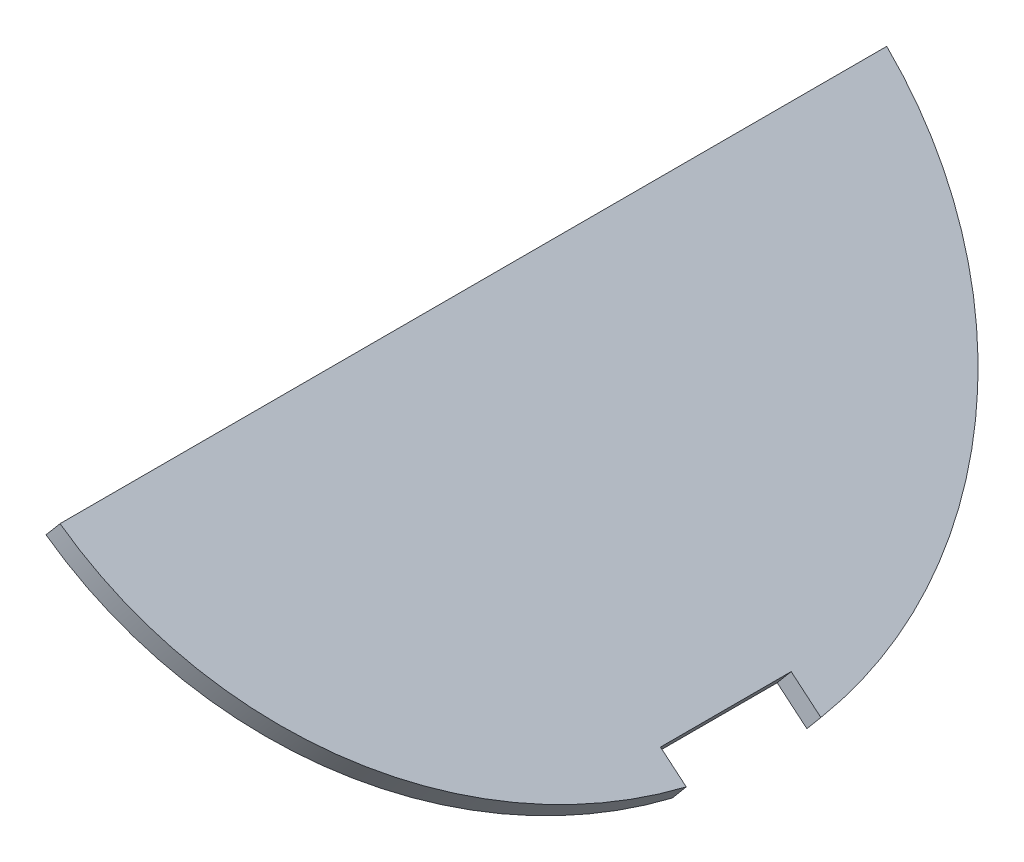
ISO-10303-21;
HEADER;
FILE_DESCRIPTION(('STEP AP214'),'2;1');
FILE_NAME('part.step','',(''),(''),'','','');
FILE_SCHEMA(('AUTOMOTIVE_DESIGN { 1 0 10303 214 1 1 1 1 }'));
ENDSEC;
DATA;
#1=APPLICATION_CONTEXT('core data for automotive mechanical design processes');
#2=APPLICATION_PROTOCOL_DEFINITION('international standard','automotive_design',2000,#1);
#3=PRODUCT_CONTEXT('',#1,'mechanical');
#4=PRODUCT('Part','Part','',(#3));
#5=PRODUCT_RELATED_PRODUCT_CATEGORY('part','',(#4));
#6=PRODUCT_DEFINITION_FORMATION('','',#4);
#7=PRODUCT_DEFINITION_CONTEXT('part definition',#1,'design');
#8=PRODUCT_DEFINITION('design','',#6,#7);
#9=PRODUCT_DEFINITION_SHAPE('','',#8);
#10=(LENGTH_UNIT() NAMED_UNIT(*) SI_UNIT(.MILLI.,.METRE.));
#11=(NAMED_UNIT(*) PLANE_ANGLE_UNIT() SI_UNIT($,.RADIAN.));
#12=(NAMED_UNIT(*) SI_UNIT($,.STERADIAN.) SOLID_ANGLE_UNIT());
#13=UNCERTAINTY_MEASURE_WITH_UNIT(LENGTH_MEASURE(1.E-05),#10,'distance_accuracy_value','');
#14=(GEOMETRIC_REPRESENTATION_CONTEXT(3) GLOBAL_UNCERTAINTY_ASSIGNED_CONTEXT((#13)) GLOBAL_UNIT_ASSIGNED_CONTEXT((#10,
#11,#12)) REPRESENTATION_CONTEXT('',''));
#15=CARTESIAN_POINT('',(0.,0.,0.));
#16=DIRECTION('',(0.,0.,1.));
#17=DIRECTION('',(1.,0.,0.));
#18=AXIS2_PLACEMENT_3D('',#15,#16,#17);
#19=CARTESIAN_POINT('',(-1.41584810725697E-13,-1.68734206839122E-13,0.));
#20=DIRECTION('',(0.642787609686538,0.766044443118979,0.));
#21=DIRECTION('',(-0.766044443118979,0.642787609686538,0.));
#22=AXIS2_PLACEMENT_3D('',#19,#20,#21);
#23=PLANE('',#22);
#24=DIRECTION('',(-0.766044443118978,0.64278760968654,0.));
#25=VECTOR('',#24,1.);
#26=CARTESIAN_POINT('',(72.2544952673912,-60.6287203297686,-11.3334101147557));
#27=LINE('',#26,#25);
#28=CARTESIAN_POINT('',(72.2544952673912,-60.6287203297686,-11.3334101147557));
#29=VERTEX_POINT('',#28);
#30=CARTESIAN_POINT('',(65.4432209264171,-54.91338254241,-11.3334101147557));
#31=VERTEX_POINT('',#30);
#32=EDGE_CURVE('E57',#29,#31,#27,.T.);
#33=ORIENTED_EDGE('',*,*,#32,.F.);
#34=CARTESIAN_POINT('',(0.,0.,0.));
#35=DIRECTION('',(0.642787609686541,0.766044443118977,0.));
#36=DIRECTION('',(-0.766044443118977,0.642787609686541,0.));
#37=AXIS2_PLACEMENT_3D('',#34,#35,#36);
#38=CIRCLE('',#37,95.);
#39=CARTESIAN_POINT('',(3.83022221559488,-3.2139380484327,-94.8683298050514));
#40=VERTEX_POINT('',#39);
#41=EDGE_CURVE('E141',#29,#40,#38,.T.);
#42=ORIENTED_EDGE('',*,*,#41,.T.);
#43=DIRECTION('',(0.,0.,1.));
#44=VECTOR('',#43,1.);
#45=CARTESIAN_POINT('',(3.83022221559489,-3.2139380484327,-94.8683298050514));
#46=LINE('',#45,#44);
#47=CARTESIAN_POINT('',(3.83022221559489,-3.2139380484327,94.8683298050514));
#48=VERTEX_POINT('',#47);
#49=EDGE_CURVE('E135',#40,#48,#46,.T.);
#50=ORIENTED_EDGE('',*,*,#49,.T.);
#51=CARTESIAN_POINT('',(0.,0.,0.));
#52=DIRECTION('',(0.64278760968654,0.766044443118977,0.));
#53=DIRECTION('',(-0.766044443118977,0.64278760968654,0.));
#54=AXIS2_PLACEMENT_3D('',#51,#52,#53);
#55=CIRCLE('',#54,95.);
#56=CARTESIAN_POINT('',(71.3555428136692,-59.8744096574047,18.6665898852443));
#57=VERTEX_POINT('',#56);
#58=EDGE_CURVE('E98',#48,#57,#55,.T.);
#59=ORIENTED_EDGE('',*,*,#58,.T.);
#60=DIRECTION('',(0.766044443118977,-0.642787609686541,0.));
#61=VECTOR('',#60,1.);
#62=CARTESIAN_POINT('',(65.4432209264171,-54.91338254241,18.6665898852443));
#63=LINE('',#62,#61);
#64=CARTESIAN_POINT('',(65.4432209264171,-54.91338254241,18.6665898852442));
#65=VERTEX_POINT('',#64);
#66=EDGE_CURVE('E96',#65,#57,#63,.T.);
#67=ORIENTED_EDGE('',*,*,#66,.F.);
#68=DIRECTION('',(0.,0.,1.));
#69=VECTOR('',#68,1.);
#70=CARTESIAN_POINT('',(65.4432209264171,-54.91338254241,-11.3334101147557));
#71=LINE('',#70,#69);
#72=EDGE_CURVE('E13',#31,#65,#71,.T.);
#73=ORIENTED_EDGE('',*,*,#72,.F.);
#74=EDGE_LOOP('',(#33,#42,#50,#59,#67,#73));
#75=FACE_BOUND('',#74,.T.);
#76=ADVANCED_FACE('F48',(#75),#23,.T.);
#77=CARTESIAN_POINT('',(0.,0.,0.));
#78=DIRECTION('',(-0.64278760968654,-0.766044443118977,0.));
#79=DIRECTION('',(0.766044443118977,-0.642787609686541,0.));
#80=AXIS2_PLACEMENT_3D('',#77,#78,#79);
#81=CYLINDRICAL_SURFACE('',#80,95.);
#82=CARTESIAN_POINT('',(-3.2139380484327,-3.83022221559489,0.));
#83=DIRECTION('',(0.642787609686541,0.766044443118977,0.));
#84=DIRECTION('',(-0.766044443118977,0.642787609686541,0.));
#85=AXIS2_PLACEMENT_3D('',#82,#83,#84);
#86=CIRCLE('',#85,95.);
#87=CARTESIAN_POINT('',(69.0405572189585,-64.4589425453635,-11.3334101147557));
#88=VERTEX_POINT('',#87);
#89=CARTESIAN_POINT('',(0.616284167162184,-7.04416026402759,-94.8683298050514));
#90=VERTEX_POINT('',#89);
#91=EDGE_CURVE('E160',#88,#90,#86,.T.);
#92=ORIENTED_EDGE('',*,*,#91,.T.);
#93=DIRECTION('',(-0.64278760968654,-0.766044443118977,0.));
#94=VECTOR('',#93,1.);
#95=CARTESIAN_POINT('',(3.83022221559489,-3.2139380484327,-94.8683298050514));
#96=LINE('',#95,#94);
#97=EDGE_CURVE('E151',#40,#90,#96,.T.);
#98=ORIENTED_EDGE('',*,*,#97,.F.);
#99=ORIENTED_EDGE('',*,*,#41,.F.);
#100=DIRECTION('',(-0.64278760968654,-0.766044443118977,0.));
#101=VECTOR('',#100,1.);
#102=CARTESIAN_POINT('',(72.2544952673912,-60.6287203297686,-11.3334101147557));
#103=LINE('',#102,#101);
#104=EDGE_CURVE('E154',#29,#88,#103,.T.);
#105=ORIENTED_EDGE('',*,*,#104,.T.);
#106=EDGE_LOOP('',(#92,#98,#99,#105));
#107=FACE_BOUND('',#106,.T.);
#108=ADVANCED_FACE('F173',(#107),#81,.T.);
#109=CARTESIAN_POINT('',(3.83022221559489,-3.2139380484327,-94.8683298050514));
#110=DIRECTION('',(0.766044443118977,-0.64278760968654,0.));
#111=DIRECTION('',(0.642787609686541,0.766044443118977,0.));
#112=AXIS2_PLACEMENT_3D('',#109,#110,#111);
#113=PLANE('',#112);
#114=DIRECTION('',(0.,0.,1.));
#115=VECTOR('',#114,1.);
#116=CARTESIAN_POINT('',(0.616284167162183,-7.04416026402759,-94.8683298050514));
#117=LINE('',#116,#115);
#118=CARTESIAN_POINT('',(0.616284167162183,-7.04416026402759,94.8683298050514));
#119=VERTEX_POINT('',#118);
#120=EDGE_CURVE('E148',#90,#119,#117,.T.);
#121=ORIENTED_EDGE('',*,*,#120,.T.);
#122=DIRECTION('',(-0.64278760968654,-0.766044443118977,0.));
#123=VECTOR('',#122,1.);
#124=CARTESIAN_POINT('',(3.83022221559489,-3.2139380484327,94.8683298050514));
#125=LINE('',#124,#123);
#126=EDGE_CURVE('E150',#48,#119,#125,.T.);
#127=ORIENTED_EDGE('',*,*,#126,.F.);
#128=ORIENTED_EDGE('',*,*,#49,.F.);
#129=ORIENTED_EDGE('',*,*,#97,.T.);
#130=EDGE_LOOP('',(#121,#127,#128,#129));
#131=FACE_BOUND('',#130,.T.);
#132=ADVANCED_FACE('F174',(#131),#113,.F.);
#133=CARTESIAN_POINT('',(0.,0.,0.));
#134=DIRECTION('',(-0.64278760968654,-0.766044443118977,0.));
#135=DIRECTION('',(0.766044443118977,-0.642787609686541,0.));
#136=AXIS2_PLACEMENT_3D('',#133,#134,#135);
#137=CYLINDRICAL_SURFACE('',#136,95.);
#138=CARTESIAN_POINT('',(-3.2139380484327,-3.83022221559489,0.));
#139=DIRECTION('',(0.64278760968654,0.766044443118977,0.));
#140=DIRECTION('',(-0.766044443118977,0.64278760968654,0.));
#141=AXIS2_PLACEMENT_3D('',#138,#139,#140);
#142=CIRCLE('',#141,95.);
#143=CARTESIAN_POINT('',(68.1416047652366,-63.7046318729996,18.6665898852443));
#144=VERTEX_POINT('',#143);
#145=EDGE_CURVE('E126',#119,#144,#142,.T.);
#146=ORIENTED_EDGE('',*,*,#145,.T.);
#147=DIRECTION('',(-0.64278760968654,-0.766044443118977,0.));
#148=VECTOR('',#147,1.);
#149=CARTESIAN_POINT('',(71.3555428136693,-59.8744096574047,18.6665898852443));
#150=LINE('',#149,#148);
#151=EDGE_CURVE('E116',#57,#144,#150,.T.);
#152=ORIENTED_EDGE('',*,*,#151,.F.);
#153=ORIENTED_EDGE('',*,*,#58,.F.);
#154=ORIENTED_EDGE('',*,*,#126,.T.);
#155=EDGE_LOOP('',(#146,#152,#153,#154));
#156=FACE_BOUND('',#155,.T.);
#157=ADVANCED_FACE('F178',(#156),#137,.T.);
#158=CARTESIAN_POINT('',(65.4432209264171,-54.91338254241,18.6665898852443));
#159=DIRECTION('',(0.,0.,-1.));
#160=DIRECTION('',(-1.,0.,0.));
#161=AXIS2_PLACEMENT_3D('',#158,#159,#160);
#162=PLANE('',#161);
#163=DIRECTION('',(0.766044443118977,-0.642787609686541,0.));
#164=VECTOR('',#163,1.);
#165=CARTESIAN_POINT('',(62.2292828779844,-58.7436047580049,18.6665898852443));
#166=LINE('',#165,#164);
#167=CARTESIAN_POINT('',(62.2292828779844,-58.7436047580049,18.6665898852443));
#168=VERTEX_POINT('',#167);
#169=EDGE_CURVE('E114',#168,#144,#166,.T.);
#170=ORIENTED_EDGE('',*,*,#169,.F.);
#171=DIRECTION('',(-0.64278760968654,-0.766044443118977,0.));
#172=VECTOR('',#171,1.);
#173=CARTESIAN_POINT('',(65.4432209264171,-54.91338254241,18.6665898852443));
#174=LINE('',#173,#172);
#175=EDGE_CURVE('E104',#65,#168,#174,.T.);
#176=ORIENTED_EDGE('',*,*,#175,.F.);
#177=ORIENTED_EDGE('',*,*,#66,.T.);
#178=ORIENTED_EDGE('',*,*,#151,.T.);
#179=EDGE_LOOP('',(#170,#176,#177,#178));
#180=FACE_BOUND('',#179,.T.);
#181=ADVANCED_FACE('F112',(#180),#162,.T.);
#182=CARTESIAN_POINT('',(72.2544952673912,-60.6287203297686,-11.3334101147557));
#183=DIRECTION('',(0.,0.,1.));
#184=DIRECTION('',(1.,0.,0.));
#185=AXIS2_PLACEMENT_3D('',#182,#183,#184);
#186=PLANE('',#185);
#187=DIRECTION('',(-0.766044443118978,0.64278760968654,0.));
#188=VECTOR('',#187,1.);
#189=CARTESIAN_POINT('',(69.0405572189585,-64.4589425453635,-11.3334101147557));
#190=LINE('',#189,#188);
#191=CARTESIAN_POINT('',(62.2292828779844,-58.7436047580049,-11.3334101147557));
#192=VERTEX_POINT('',#191);
#193=EDGE_CURVE('E136',#88,#192,#190,.T.);
#194=ORIENTED_EDGE('',*,*,#193,.F.);
#195=ORIENTED_EDGE('',*,*,#104,.F.);
#196=ORIENTED_EDGE('',*,*,#32,.T.);
#197=DIRECTION('',(-0.64278760968654,-0.766044443118977,0.));
#198=VECTOR('',#197,1.);
#199=CARTESIAN_POINT('',(65.4432209264171,-54.91338254241,-11.3334101147557));
#200=LINE('',#199,#198);
#201=EDGE_CURVE('E111',#31,#192,#200,.T.);
#202=ORIENTED_EDGE('',*,*,#201,.T.);
#203=EDGE_LOOP('',(#194,#195,#196,#202));
#204=FACE_BOUND('',#203,.T.);
#205=ADVANCED_FACE('F193',(#204),#186,.T.);
#206=CARTESIAN_POINT('',(-3.21393804843255,-3.83022221559471,0.));
#207=DIRECTION('',(-0.642787609686541,-0.766044443118977,0.));
#208=DIRECTION('',(0.766044443118977,-0.642787609686541,0.));
#209=AXIS2_PLACEMENT_3D('',#206,#207,#208);
#210=PLANE('',#209);
#211=ORIENTED_EDGE('',*,*,#91,.F.);
#212=ORIENTED_EDGE('',*,*,#193,.T.);
#213=DIRECTION('',(0.,0.,1.));
#214=VECTOR('',#213,1.);
#215=CARTESIAN_POINT('',(62.2292828779844,-58.7436047580049,-11.3334101147557));
#216=LINE('',#215,#214);
#217=EDGE_CURVE('E103',#192,#168,#216,.T.);
#218=ORIENTED_EDGE('',*,*,#217,.T.);
#219=ORIENTED_EDGE('',*,*,#169,.T.);
#220=ORIENTED_EDGE('',*,*,#145,.F.);
#221=ORIENTED_EDGE('',*,*,#120,.F.);
#222=EDGE_LOOP('',(#211,#212,#218,#219,#220,#221));
#223=FACE_BOUND('',#222,.T.);
#224=ADVANCED_FACE('F50',(#223),#210,.T.);
#225=CARTESIAN_POINT('',(65.4432209264171,-54.91338254241,-11.3334101147557));
#226=DIRECTION('',(0.766044443118977,-0.64278760968654,0.));
#227=DIRECTION('',(0.642787609686541,0.766044443118977,0.));
#228=AXIS2_PLACEMENT_3D('',#225,#226,#227);
#229=PLANE('',#228);
#230=ORIENTED_EDGE('',*,*,#217,.F.);
#231=ORIENTED_EDGE('',*,*,#201,.F.);
#232=ORIENTED_EDGE('',*,*,#72,.T.);
#233=ORIENTED_EDGE('',*,*,#175,.T.);
#234=EDGE_LOOP('',(#230,#231,#232,#233));
#235=FACE_BOUND('',#234,.T.);
#236=ADVANCED_FACE('F108',(#235),#229,.T.);
#237=CLOSED_SHELL('',(#76,#108,#132,#157,#181,#205,#224,#236));
#238=MANIFOLD_SOLID_BREP('B2',#237);
#239=ADVANCED_BREP_SHAPE_REPRESENTATION('',(#18,#238),#14);
#240=SHAPE_DEFINITION_REPRESENTATION(#9,#239);
ENDSEC;
END-ISO-10303-21;
